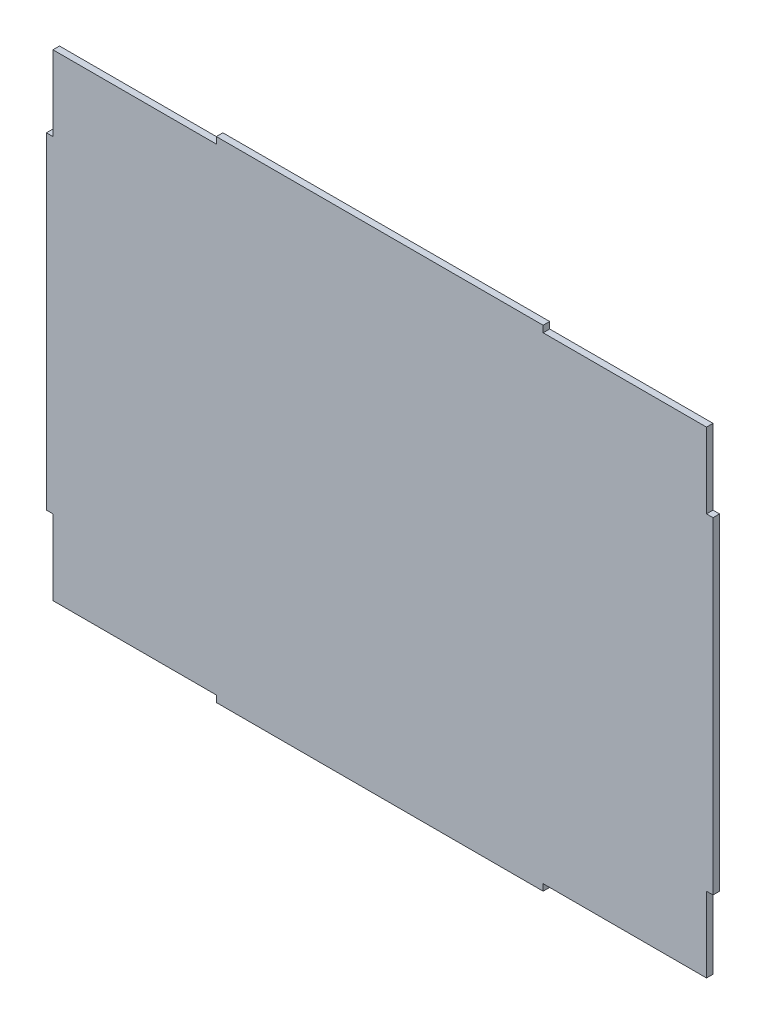
ISO-10303-21;
HEADER;
FILE_DESCRIPTION(('STEP AP214'),'2;1');
FILE_NAME('part.step','',(''),(''),'','','');
FILE_SCHEMA(('AUTOMOTIVE_DESIGN { 1 0 10303 214 1 1 1 1 }'));
ENDSEC;
DATA;
#1=APPLICATION_CONTEXT('core data for automotive mechanical design processes');
#2=APPLICATION_PROTOCOL_DEFINITION('international standard','automotive_design',2000,#1);
#3=PRODUCT_CONTEXT('',#1,'mechanical');
#4=PRODUCT('Part','Part','',(#3));
#5=PRODUCT_RELATED_PRODUCT_CATEGORY('part','',(#4));
#6=PRODUCT_DEFINITION_FORMATION('','',#4);
#7=PRODUCT_DEFINITION_CONTEXT('part definition',#1,'design');
#8=PRODUCT_DEFINITION('design','',#6,#7);
#9=PRODUCT_DEFINITION_SHAPE('','',#8);
#10=(LENGTH_UNIT() NAMED_UNIT(*) SI_UNIT(.MILLI.,.METRE.));
#11=(NAMED_UNIT(*) PLANE_ANGLE_UNIT() SI_UNIT($,.RADIAN.));
#12=(NAMED_UNIT(*) SI_UNIT($,.STERADIAN.) SOLID_ANGLE_UNIT());
#13=UNCERTAINTY_MEASURE_WITH_UNIT(LENGTH_MEASURE(1.E-05),#10,'distance_accuracy_value','');
#14=(GEOMETRIC_REPRESENTATION_CONTEXT(3) GLOBAL_UNCERTAINTY_ASSIGNED_CONTEXT((#13)) GLOBAL_UNIT_ASSIGNED_CONTEXT((#10,
#11,#12)) REPRESENTATION_CONTEXT('',''));
#15=CARTESIAN_POINT('',(0.,0.,0.));
#16=DIRECTION('',(0.,0.,1.));
#17=DIRECTION('',(1.,0.,0.));
#18=AXIS2_PLACEMENT_3D('',#15,#16,#17);
#19=CARTESIAN_POINT('',(0.,0.,2.));
#20=DIRECTION('',(0.,-1.,0.));
#21=DIRECTION('',(0.,0.,-1.));
#22=AXIS2_PLACEMENT_3D('',#19,#20,#21);
#23=PLANE('',#22);
#24=DIRECTION('',(-1.,0.,0.));
#25=VECTOR('',#24,1.);
#26=CARTESIAN_POINT('',(0.,0.,0.));
#27=LINE('',#26,#25);
#28=CARTESIAN_POINT('',(50.,0.,0.));
#29=VERTEX_POINT('',#28);
#30=CARTESIAN_POINT('',(0.,0.,0.));
#31=VERTEX_POINT('',#30);
#32=EDGE_CURVE('E158',#29,#31,#27,.T.);
#33=ORIENTED_EDGE('',*,*,#32,.T.);
#34=DIRECTION('',(0.,0.,-1.));
#35=VECTOR('',#34,1.);
#36=CARTESIAN_POINT('',(0.,0.,2.));
#37=LINE('',#36,#35);
#38=CARTESIAN_POINT('',(0.,0.,2.));
#39=VERTEX_POINT('',#38);
#40=EDGE_CURVE('E11',#39,#31,#37,.T.);
#41=ORIENTED_EDGE('',*,*,#40,.F.);
#42=DIRECTION('',(-1.,0.,0.));
#43=VECTOR('',#42,1.);
#44=CARTESIAN_POINT('',(0.,0.,2.));
#45=LINE('',#44,#43);
#46=CARTESIAN_POINT('',(50.,0.,2.));
#47=VERTEX_POINT('',#46);
#48=EDGE_CURVE('E179',#47,#39,#45,.T.);
#49=ORIENTED_EDGE('',*,*,#48,.F.);
#50=DIRECTION('',(0.,0.,-1.));
#51=VECTOR('',#50,1.);
#52=CARTESIAN_POINT('',(50.,0.,2.));
#53=LINE('',#52,#51);
#54=EDGE_CURVE('E157',#47,#29,#53,.T.);
#55=ORIENTED_EDGE('',*,*,#54,.T.);
#56=EDGE_LOOP('',(#33,#41,#49,#55));
#57=FACE_BOUND('',#56,.T.);
#58=ADVANCED_FACE('F33',(#57),#23,.F.);
#59=CARTESIAN_POINT('',(0.,0.,2.));
#60=DIRECTION('',(1.,0.,0.));
#61=DIRECTION('',(0.,1.,0.));
#62=AXIS2_PLACEMENT_3D('',#59,#60,#61);
#63=PLANE('',#62);
#64=DIRECTION('',(0.,-1.,0.));
#65=VECTOR('',#64,1.);
#66=CARTESIAN_POINT('',(0.,0.,0.));
#67=LINE('',#66,#65);
#68=CARTESIAN_POINT('',(0.,-23.,0.));
#69=VERTEX_POINT('',#68);
#70=EDGE_CURVE('E161',#31,#69,#67,.T.);
#71=ORIENTED_EDGE('',*,*,#70,.T.);
#72=DIRECTION('',(0.,0.,-1.));
#73=VECTOR('',#72,1.);
#74=CARTESIAN_POINT('',(0.,-23.,2.));
#75=LINE('',#74,#73);
#76=CARTESIAN_POINT('',(0.,-23.,2.));
#77=VERTEX_POINT('',#76);
#78=EDGE_CURVE('E41',#77,#69,#75,.T.);
#79=ORIENTED_EDGE('',*,*,#78,.F.);
#80=DIRECTION('',(0.,-1.,0.));
#81=VECTOR('',#80,1.);
#82=CARTESIAN_POINT('',(0.,0.,2.));
#83=LINE('',#82,#81);
#84=EDGE_CURVE('E99',#39,#77,#83,.T.);
#85=ORIENTED_EDGE('',*,*,#84,.F.);
#86=ORIENTED_EDGE('',*,*,#40,.T.);
#87=EDGE_LOOP('',(#71,#79,#85,#86));
#88=FACE_BOUND('',#87,.T.);
#89=ADVANCED_FACE('F380',(#88),#63,.F.);
#90=CARTESIAN_POINT('',(0.,-23.,2.));
#91=DIRECTION('',(0.,-1.,0.));
#92=DIRECTION('',(0.,0.,-1.));
#93=AXIS2_PLACEMENT_3D('',#90,#91,#92);
#94=PLANE('',#93);
#95=DIRECTION('',(-1.,0.,0.));
#96=VECTOR('',#95,1.);
#97=CARTESIAN_POINT('',(0.,-23.,0.));
#98=LINE('',#97,#96);
#99=CARTESIAN_POINT('',(-2.,-23.,0.));
#100=VERTEX_POINT('',#99);
#101=EDGE_CURVE('E164',#69,#100,#98,.T.);
#102=ORIENTED_EDGE('',*,*,#101,.T.);
#103=DIRECTION('',(0.,0.,-1.));
#104=VECTOR('',#103,1.);
#105=CARTESIAN_POINT('',(-2.,-23.,2.));
#106=LINE('',#105,#104);
#107=CARTESIAN_POINT('',(-2.,-23.,2.));
#108=VERTEX_POINT('',#107);
#109=EDGE_CURVE('E192',#108,#100,#106,.T.);
#110=ORIENTED_EDGE('',*,*,#109,.F.);
#111=DIRECTION('',(-1.,0.,0.));
#112=VECTOR('',#111,1.);
#113=CARTESIAN_POINT('',(0.,-23.,2.));
#114=LINE('',#113,#112);
#115=EDGE_CURVE('E200',#77,#108,#114,.T.);
#116=ORIENTED_EDGE('',*,*,#115,.F.);
#117=ORIENTED_EDGE('',*,*,#78,.T.);
#118=EDGE_LOOP('',(#102,#110,#116,#117));
#119=FACE_BOUND('',#118,.T.);
#120=ADVANCED_FACE('F198',(#119),#94,.F.);
#121=CARTESIAN_POINT('',(-2.,-23.,2.));
#122=DIRECTION('',(1.,0.,0.));
#123=DIRECTION('',(0.,1.,0.));
#124=AXIS2_PLACEMENT_3D('',#121,#122,#123);
#125=PLANE('',#124);
#126=DIRECTION('',(0.,-1.,0.));
#127=VECTOR('',#126,1.);
#128=CARTESIAN_POINT('',(-2.,-23.,0.));
#129=LINE('',#128,#127);
#130=CARTESIAN_POINT('',(-1.99999999999998,-123.,0.));
#131=VERTEX_POINT('',#130);
#132=EDGE_CURVE('E166',#100,#131,#129,.T.);
#133=ORIENTED_EDGE('',*,*,#132,.T.);
#134=DIRECTION('',(0.,0.,-1.));
#135=VECTOR('',#134,1.);
#136=CARTESIAN_POINT('',(-1.99999999999998,-123.,2.));
#137=LINE('',#136,#135);
#138=CARTESIAN_POINT('',(-1.99999999999998,-123.,2.));
#139=VERTEX_POINT('',#138);
#140=EDGE_CURVE('E189',#139,#131,#137,.T.);
#141=ORIENTED_EDGE('',*,*,#140,.F.);
#142=DIRECTION('',(0.,-1.,0.));
#143=VECTOR('',#142,1.);
#144=CARTESIAN_POINT('',(-2.,-23.,2.));
#145=LINE('',#144,#143);
#146=EDGE_CURVE('E218',#108,#139,#145,.T.);
#147=ORIENTED_EDGE('',*,*,#146,.F.);
#148=ORIENTED_EDGE('',*,*,#109,.T.);
#149=EDGE_LOOP('',(#133,#141,#147,#148));
#150=FACE_BOUND('',#149,.T.);
#151=ADVANCED_FACE('F209',(#150),#125,.F.);
#152=CARTESIAN_POINT('',(-1.99999999999998,-123.,2.));
#153=DIRECTION('',(0.,1.,0.));
#154=DIRECTION('',(0.,0.,1.));
#155=AXIS2_PLACEMENT_3D('',#152,#153,#154);
#156=PLANE('',#155);
#157=DIRECTION('',(1.,0.,0.));
#158=VECTOR('',#157,1.);
#159=CARTESIAN_POINT('',(-1.99999999999998,-123.,0.));
#160=LINE('',#159,#158);
#161=CARTESIAN_POINT('',(0.,-123.,0.));
#162=VERTEX_POINT('',#161);
#163=EDGE_CURVE('E168',#131,#162,#160,.T.);
#164=ORIENTED_EDGE('',*,*,#163,.T.);
#165=DIRECTION('',(0.,0.,-1.));
#166=VECTOR('',#165,1.);
#167=CARTESIAN_POINT('',(0.,-123.,2.));
#168=LINE('',#167,#166);
#169=CARTESIAN_POINT('',(0.,-123.,2.));
#170=VERTEX_POINT('',#169);
#171=EDGE_CURVE('E186',#170,#162,#168,.T.);
#172=ORIENTED_EDGE('',*,*,#171,.F.);
#173=DIRECTION('',(1.,0.,0.));
#174=VECTOR('',#173,1.);
#175=CARTESIAN_POINT('',(-1.99999999999998,-123.,2.));
#176=LINE('',#175,#174);
#177=EDGE_CURVE('E215',#139,#170,#176,.T.);
#178=ORIENTED_EDGE('',*,*,#177,.F.);
#179=ORIENTED_EDGE('',*,*,#140,.T.);
#180=EDGE_LOOP('',(#164,#172,#178,#179));
#181=FACE_BOUND('',#180,.T.);
#182=ADVANCED_FACE('F213',(#181),#156,.F.);
#183=CARTESIAN_POINT('',(0.,-123.,2.));
#184=DIRECTION('',(1.,0.,0.));
#185=DIRECTION('',(0.,1.,0.));
#186=AXIS2_PLACEMENT_3D('',#183,#184,#185);
#187=PLANE('',#186);
#188=DIRECTION('',(0.,-1.,0.));
#189=VECTOR('',#188,1.);
#190=CARTESIAN_POINT('',(0.,-123.,0.));
#191=LINE('',#190,#189);
#192=CARTESIAN_POINT('',(0.,-146.,0.));
#193=VERTEX_POINT('',#192);
#194=EDGE_CURVE('E170',#162,#193,#191,.T.);
#195=ORIENTED_EDGE('',*,*,#194,.T.);
#196=DIRECTION('',(0.,0.,-1.));
#197=VECTOR('',#196,1.);
#198=CARTESIAN_POINT('',(0.,-146.,2.));
#199=LINE('',#198,#197);
#200=CARTESIAN_POINT('',(0.,-146.,2.));
#201=VERTEX_POINT('',#200);
#202=EDGE_CURVE('E183',#201,#193,#199,.T.);
#203=ORIENTED_EDGE('',*,*,#202,.F.);
#204=DIRECTION('',(0.,-1.,0.));
#205=VECTOR('',#204,1.);
#206=CARTESIAN_POINT('',(0.,-123.,2.));
#207=LINE('',#206,#205);
#208=EDGE_CURVE('E217',#170,#201,#207,.T.);
#209=ORIENTED_EDGE('',*,*,#208,.F.);
#210=ORIENTED_EDGE('',*,*,#171,.T.);
#211=EDGE_LOOP('',(#195,#203,#209,#210));
#212=FACE_BOUND('',#211,.T.);
#213=ADVANCED_FACE('F392',(#212),#187,.F.);
#214=CARTESIAN_POINT('',(0.,-146.,2.));
#215=DIRECTION('',(0.,1.,0.));
#216=DIRECTION('',(0.,0.,1.));
#217=AXIS2_PLACEMENT_3D('',#214,#215,#216);
#218=PLANE('',#217);
#219=DIRECTION('',(1.,0.,0.));
#220=VECTOR('',#219,1.);
#221=CARTESIAN_POINT('',(0.,-146.,0.));
#222=LINE('',#221,#220);
#223=CARTESIAN_POINT('',(50.,-146.,0.));
#224=VERTEX_POINT('',#223);
#225=EDGE_CURVE('E172',#193,#224,#222,.T.);
#226=ORIENTED_EDGE('',*,*,#225,.T.);
#227=DIRECTION('',(0.,0.,-1.));
#228=VECTOR('',#227,1.);
#229=CARTESIAN_POINT('',(50.,-146.,2.));
#230=LINE('',#229,#228);
#231=CARTESIAN_POINT('',(50.,-146.,2.));
#232=VERTEX_POINT('',#231);
#233=EDGE_CURVE('E144',#232,#224,#230,.T.);
#234=ORIENTED_EDGE('',*,*,#233,.F.);
#235=DIRECTION('',(1.,0.,0.));
#236=VECTOR('',#235,1.);
#237=CARTESIAN_POINT('',(0.,-146.,2.));
#238=LINE('',#237,#236);
#239=EDGE_CURVE('E131',#201,#232,#238,.T.);
#240=ORIENTED_EDGE('',*,*,#239,.F.);
#241=ORIENTED_EDGE('',*,*,#202,.T.);
#242=EDGE_LOOP('',(#226,#234,#240,#241));
#243=FACE_BOUND('',#242,.T.);
#244=ADVANCED_FACE('F395',(#243),#218,.F.);
#245=CARTESIAN_POINT('',(50.,-146.,2.));
#246=DIRECTION('',(1.,0.,0.));
#247=DIRECTION('',(0.,0.,-1.));
#248=AXIS2_PLACEMENT_3D('',#245,#246,#247);
#249=PLANE('',#248);
#250=DIRECTION('',(0.,-1.,0.));
#251=VECTOR('',#250,1.);
#252=CARTESIAN_POINT('',(50.,-146.,0.));
#253=LINE('',#252,#251);
#254=CARTESIAN_POINT('',(50.,-148.,0.));
#255=VERTEX_POINT('',#254);
#256=EDGE_CURVE('E140',#224,#255,#253,.T.);
#257=ORIENTED_EDGE('',*,*,#256,.T.);
#258=DIRECTION('',(0.,0.,-1.));
#259=VECTOR('',#258,1.);
#260=CARTESIAN_POINT('',(50.,-148.,2.));
#261=LINE('',#260,#259);
#262=CARTESIAN_POINT('',(50.,-148.,2.));
#263=VERTEX_POINT('',#262);
#264=EDGE_CURVE('E137',#263,#255,#261,.T.);
#265=ORIENTED_EDGE('',*,*,#264,.F.);
#266=DIRECTION('',(0.,-1.,0.));
#267=VECTOR('',#266,1.);
#268=CARTESIAN_POINT('',(50.,-146.,2.));
#269=LINE('',#268,#267);
#270=EDGE_CURVE('E122',#232,#263,#269,.T.);
#271=ORIENTED_EDGE('',*,*,#270,.F.);
#272=ORIENTED_EDGE('',*,*,#233,.T.);
#273=EDGE_LOOP('',(#257,#265,#271,#272));
#274=FACE_BOUND('',#273,.T.);
#275=ADVANCED_FACE('F138',(#274),#249,.F.);
#276=CARTESIAN_POINT('',(50.,-148.,2.));
#277=DIRECTION('',(0.,1.,0.));
#278=DIRECTION('',(0.,0.,1.));
#279=AXIS2_PLACEMENT_3D('',#276,#277,#278);
#280=PLANE('',#279);
#281=DIRECTION('',(1.,0.,0.));
#282=VECTOR('',#281,1.);
#283=CARTESIAN_POINT('',(50.,-148.,0.));
#284=LINE('',#283,#282);
#285=CARTESIAN_POINT('',(150.,-148.,0.));
#286=VERTEX_POINT('',#285);
#287=EDGE_CURVE('E175',#255,#286,#284,.T.);
#288=ORIENTED_EDGE('',*,*,#287,.T.);
#289=DIRECTION('',(0.,0.,-1.));
#290=VECTOR('',#289,1.);
#291=CARTESIAN_POINT('',(150.,-148.,2.));
#292=LINE('',#291,#290);
#293=CARTESIAN_POINT('',(150.,-148.,2.));
#294=VERTEX_POINT('',#293);
#295=EDGE_CURVE('E149',#294,#286,#292,.T.);
#296=ORIENTED_EDGE('',*,*,#295,.F.);
#297=DIRECTION('',(1.,0.,0.));
#298=VECTOR('',#297,1.);
#299=CARTESIAN_POINT('',(50.,-148.,2.));
#300=LINE('',#299,#298);
#301=EDGE_CURVE('E128',#263,#294,#300,.T.);
#302=ORIENTED_EDGE('',*,*,#301,.F.);
#303=ORIENTED_EDGE('',*,*,#264,.T.);
#304=EDGE_LOOP('',(#288,#296,#302,#303));
#305=FACE_BOUND('',#304,.T.);
#306=ADVANCED_FACE('F147',(#305),#280,.F.);
#307=CARTESIAN_POINT('',(100.,2.00000000000001,2.));
#308=DIRECTION('',(0.,-1.,0.));
#309=DIRECTION('',(1.,0.,0.));
#310=AXIS2_PLACEMENT_3D('',#307,#308,#309);
#311=PLANE('',#310);
#312=DIRECTION('',(-1.,0.,0.));
#313=VECTOR('',#312,1.);
#314=CARTESIAN_POINT('',(100.,2.00000000000001,0.));
#315=LINE('',#314,#313);
#316=CARTESIAN_POINT('',(150.,2.00000000000001,0.));
#317=VERTEX_POINT('',#316);
#318=CARTESIAN_POINT('',(50.,2.,0.));
#319=VERTEX_POINT('',#318);
#320=EDGE_CURVE('E85',#317,#319,#315,.T.);
#321=ORIENTED_EDGE('',*,*,#320,.T.);
#322=DIRECTION('',(0.,0.,-1.));
#323=VECTOR('',#322,1.);
#324=CARTESIAN_POINT('',(50.,2.,2.));
#325=LINE('',#324,#323);
#326=CARTESIAN_POINT('',(50.,2.,2.));
#327=VERTEX_POINT('',#326);
#328=EDGE_CURVE('E145',#327,#319,#325,.T.);
#329=ORIENTED_EDGE('',*,*,#328,.F.);
#330=DIRECTION('',(-1.,0.,0.));
#331=VECTOR('',#330,1.);
#332=CARTESIAN_POINT('',(100.,2.00000000000001,2.));
#333=LINE('',#332,#331);
#334=CARTESIAN_POINT('',(150.,2.00000000000001,2.));
#335=VERTEX_POINT('',#334);
#336=EDGE_CURVE('E151',#335,#327,#333,.T.);
#337=ORIENTED_EDGE('',*,*,#336,.F.);
#338=DIRECTION('',(0.,0.,-1.));
#339=VECTOR('',#338,1.);
#340=CARTESIAN_POINT('',(150.,2.00000000000001,2.));
#341=LINE('',#340,#339);
#342=EDGE_CURVE('E228',#335,#317,#341,.T.);
#343=ORIENTED_EDGE('',*,*,#342,.T.);
#344=EDGE_LOOP('',(#321,#329,#337,#343));
#345=FACE_BOUND('',#344,.T.);
#346=ADVANCED_FACE('F375',(#345),#311,.F.);
#347=CARTESIAN_POINT('',(50.,2.,2.));
#348=DIRECTION('',(1.,0.,0.));
#349=DIRECTION('',(0.,0.,-1.));
#350=AXIS2_PLACEMENT_3D('',#347,#348,#349);
#351=PLANE('',#350);
#352=DIRECTION('',(0.,-1.,0.));
#353=VECTOR('',#352,1.);
#354=CARTESIAN_POINT('',(50.,2.,0.));
#355=LINE('',#354,#353);
#356=EDGE_CURVE('E91',#319,#29,#355,.T.);
#357=ORIENTED_EDGE('',*,*,#356,.T.);
#358=ORIENTED_EDGE('',*,*,#54,.F.);
#359=DIRECTION('',(0.,-1.,0.));
#360=VECTOR('',#359,1.);
#361=CARTESIAN_POINT('',(50.,2.,2.));
#362=LINE('',#361,#360);
#363=EDGE_CURVE('E49',#327,#47,#362,.T.);
#364=ORIENTED_EDGE('',*,*,#363,.F.);
#365=ORIENTED_EDGE('',*,*,#328,.T.);
#366=EDGE_LOOP('',(#357,#358,#364,#365));
#367=FACE_BOUND('',#366,.T.);
#368=ADVANCED_FACE('F376',(#367),#351,.F.);
#369=CARTESIAN_POINT('',(0.,0.,2.));
#370=DIRECTION('',(0.,0.,-1.));
#371=DIRECTION('',(-1.,0.,0.));
#372=AXIS2_PLACEMENT_3D('',#369,#370,#371);
#373=PLANE('',#372);
#374=ORIENTED_EDGE('',*,*,#48,.T.);
#375=ORIENTED_EDGE('',*,*,#84,.T.);
#376=ORIENTED_EDGE('',*,*,#115,.T.);
#377=ORIENTED_EDGE('',*,*,#146,.T.);
#378=ORIENTED_EDGE('',*,*,#177,.T.);
#379=ORIENTED_EDGE('',*,*,#208,.T.);
#380=ORIENTED_EDGE('',*,*,#239,.T.);
#381=ORIENTED_EDGE('',*,*,#270,.T.);
#382=ORIENTED_EDGE('',*,*,#301,.T.);
#383=DIRECTION('',(0.,-1.,0.));
#384=VECTOR('',#383,1.);
#385=CARTESIAN_POINT('',(150.,-146.,2.));
#386=LINE('',#385,#384);
#387=CARTESIAN_POINT('',(150.,-146.,2.));
#388=VERTEX_POINT('',#387);
#389=EDGE_CURVE('E298',#388,#294,#386,.T.);
#390=ORIENTED_EDGE('',*,*,#389,.F.);
#391=DIRECTION('',(-1.,0.,0.));
#392=VECTOR('',#391,1.);
#393=CARTESIAN_POINT('',(200.,-146.,2.));
#394=LINE('',#393,#392);
#395=CARTESIAN_POINT('',(200.,-146.,2.));
#396=VERTEX_POINT('',#395);
#397=EDGE_CURVE('E295',#396,#388,#394,.T.);
#398=ORIENTED_EDGE('',*,*,#397,.F.);
#399=DIRECTION('',(0.,-1.,0.));
#400=VECTOR('',#399,1.);
#401=CARTESIAN_POINT('',(200.,-123.,2.));
#402=LINE('',#401,#400);
#403=CARTESIAN_POINT('',(200.,-123.,2.));
#404=VERTEX_POINT('',#403);
#405=EDGE_CURVE('E292',#404,#396,#402,.T.);
#406=ORIENTED_EDGE('',*,*,#405,.F.);
#407=DIRECTION('',(-1.,0.,0.));
#408=VECTOR('',#407,1.);
#409=CARTESIAN_POINT('',(202.,-123.,2.));
#410=LINE('',#409,#408);
#411=CARTESIAN_POINT('',(202.,-123.,2.));
#412=VERTEX_POINT('',#411);
#413=EDGE_CURVE('E289',#412,#404,#410,.T.);
#414=ORIENTED_EDGE('',*,*,#413,.F.);
#415=DIRECTION('',(0.,-1.,0.));
#416=VECTOR('',#415,1.);
#417=CARTESIAN_POINT('',(202.,-23.,2.));
#418=LINE('',#417,#416);
#419=CARTESIAN_POINT('',(202.,-23.,2.));
#420=VERTEX_POINT('',#419);
#421=EDGE_CURVE('E286',#420,#412,#418,.T.);
#422=ORIENTED_EDGE('',*,*,#421,.F.);
#423=DIRECTION('',(1.,0.,0.));
#424=VECTOR('',#423,1.);
#425=CARTESIAN_POINT('',(200.,-23.,2.));
#426=LINE('',#425,#424);
#427=CARTESIAN_POINT('',(200.,-23.,2.));
#428=VERTEX_POINT('',#427);
#429=EDGE_CURVE('E283',#428,#420,#426,.T.);
#430=ORIENTED_EDGE('',*,*,#429,.F.);
#431=DIRECTION('',(0.,-1.,0.));
#432=VECTOR('',#431,1.);
#433=CARTESIAN_POINT('',(200.,0.,2.));
#434=LINE('',#433,#432);
#435=CARTESIAN_POINT('',(200.,0.,2.));
#436=VERTEX_POINT('',#435);
#437=EDGE_CURVE('E252',#436,#428,#434,.T.);
#438=ORIENTED_EDGE('',*,*,#437,.F.);
#439=DIRECTION('',(1.,0.,0.));
#440=VECTOR('',#439,1.);
#441=CARTESIAN_POINT('',(200.,0.,2.));
#442=LINE('',#441,#440);
#443=CARTESIAN_POINT('',(150.,0.,2.));
#444=VERTEX_POINT('',#443);
#445=EDGE_CURVE('E256',#444,#436,#442,.T.);
#446=ORIENTED_EDGE('',*,*,#445,.F.);
#447=DIRECTION('',(0.,-1.,0.));
#448=VECTOR('',#447,1.);
#449=CARTESIAN_POINT('',(150.,2.00000000000001,2.));
#450=LINE('',#449,#448);
#451=EDGE_CURVE('E300',#335,#444,#450,.T.);
#452=ORIENTED_EDGE('',*,*,#451,.F.);
#453=ORIENTED_EDGE('',*,*,#336,.T.);
#454=ORIENTED_EDGE('',*,*,#363,.T.);
#455=EDGE_LOOP('',(#374,#375,#376,#377,#378,#379,#380,#381,#382,#390,#398,#406,#414,#422,#430,
#438,#446,#452,#453,#454));
#456=FACE_BOUND('',#455,.T.);
#457=ADVANCED_FACE('F124',(#456),#373,.F.);
#458=CARTESIAN_POINT('',(0.,0.,0.));
#459=DIRECTION('',(0.,0.,-1.));
#460=DIRECTION('',(-1.,0.,0.));
#461=AXIS2_PLACEMENT_3D('',#458,#459,#460);
#462=PLANE('',#461);
#463=ORIENTED_EDGE('',*,*,#32,.F.);
#464=ORIENTED_EDGE('',*,*,#356,.F.);
#465=ORIENTED_EDGE('',*,*,#320,.F.);
#466=DIRECTION('',(0.,-1.,0.));
#467=VECTOR('',#466,1.);
#468=CARTESIAN_POINT('',(150.,2.00000000000001,0.));
#469=LINE('',#468,#467);
#470=CARTESIAN_POINT('',(150.,0.,0.));
#471=VERTEX_POINT('',#470);
#472=EDGE_CURVE('E275',#317,#471,#469,.T.);
#473=ORIENTED_EDGE('',*,*,#472,.T.);
#474=DIRECTION('',(1.,0.,0.));
#475=VECTOR('',#474,1.);
#476=CARTESIAN_POINT('',(200.,0.,0.));
#477=LINE('',#476,#475);
#478=CARTESIAN_POINT('',(200.,0.,0.));
#479=VERTEX_POINT('',#478);
#480=EDGE_CURVE('E278',#471,#479,#477,.T.);
#481=ORIENTED_EDGE('',*,*,#480,.T.);
#482=DIRECTION('',(0.,-1.,0.));
#483=VECTOR('',#482,1.);
#484=CARTESIAN_POINT('',(200.,0.,0.));
#485=LINE('',#484,#483);
#486=CARTESIAN_POINT('',(200.,-23.,0.));
#487=VERTEX_POINT('',#486);
#488=EDGE_CURVE('E253',#479,#487,#485,.T.);
#489=ORIENTED_EDGE('',*,*,#488,.T.);
#490=DIRECTION('',(1.,0.,0.));
#491=VECTOR('',#490,1.);
#492=CARTESIAN_POINT('',(200.,-23.,0.));
#493=LINE('',#492,#491);
#494=CARTESIAN_POINT('',(202.,-23.,0.));
#495=VERTEX_POINT('',#494);
#496=EDGE_CURVE('E257',#487,#495,#493,.T.);
#497=ORIENTED_EDGE('',*,*,#496,.T.);
#498=DIRECTION('',(0.,-1.,0.));
#499=VECTOR('',#498,1.);
#500=CARTESIAN_POINT('',(202.,-23.,0.));
#501=LINE('',#500,#499);
#502=CARTESIAN_POINT('',(202.,-123.,0.));
#503=VERTEX_POINT('',#502);
#504=EDGE_CURVE('E260',#495,#503,#501,.T.);
#505=ORIENTED_EDGE('',*,*,#504,.T.);
#506=DIRECTION('',(-1.,0.,0.));
#507=VECTOR('',#506,1.);
#508=CARTESIAN_POINT('',(202.,-123.,0.));
#509=LINE('',#508,#507);
#510=CARTESIAN_POINT('',(200.,-123.,0.));
#511=VERTEX_POINT('',#510);
#512=EDGE_CURVE('E263',#503,#511,#509,.T.);
#513=ORIENTED_EDGE('',*,*,#512,.T.);
#514=DIRECTION('',(0.,-1.,0.));
#515=VECTOR('',#514,1.);
#516=CARTESIAN_POINT('',(200.,-123.,0.));
#517=LINE('',#516,#515);
#518=CARTESIAN_POINT('',(200.,-146.,0.));
#519=VERTEX_POINT('',#518);
#520=EDGE_CURVE('E266',#511,#519,#517,.T.);
#521=ORIENTED_EDGE('',*,*,#520,.T.);
#522=DIRECTION('',(-1.,0.,0.));
#523=VECTOR('',#522,1.);
#524=CARTESIAN_POINT('',(200.,-146.,0.));
#525=LINE('',#524,#523);
#526=CARTESIAN_POINT('',(150.,-146.,0.));
#527=VERTEX_POINT('',#526);
#528=EDGE_CURVE('E269',#519,#527,#525,.T.);
#529=ORIENTED_EDGE('',*,*,#528,.T.);
#530=DIRECTION('',(0.,-1.,0.));
#531=VECTOR('',#530,1.);
#532=CARTESIAN_POINT('',(150.,-146.,0.));
#533=LINE('',#532,#531);
#534=EDGE_CURVE('E272',#527,#286,#533,.T.);
#535=ORIENTED_EDGE('',*,*,#534,.T.);
#536=ORIENTED_EDGE('',*,*,#287,.F.);
#537=ORIENTED_EDGE('',*,*,#256,.F.);
#538=ORIENTED_EDGE('',*,*,#225,.F.);
#539=ORIENTED_EDGE('',*,*,#194,.F.);
#540=ORIENTED_EDGE('',*,*,#163,.F.);
#541=ORIENTED_EDGE('',*,*,#132,.F.);
#542=ORIENTED_EDGE('',*,*,#101,.F.);
#543=ORIENTED_EDGE('',*,*,#70,.F.);
#544=EDGE_LOOP('',(#463,#464,#465,#473,#481,#489,#497,#505,#513,#521,#529,#535,#536,#537,#538,
#539,#540,#541,#542,#543));
#545=FACE_BOUND('',#544,.T.);
#546=ADVANCED_FACE('F204',(#545),#462,.T.);
#547=CARTESIAN_POINT('',(200.,0.,2.));
#548=DIRECTION('',(0.,1.,0.));
#549=DIRECTION('',(-1.,0.,0.));
#550=AXIS2_PLACEMENT_3D('',#547,#548,#549);
#551=PLANE('',#550);
#552=ORIENTED_EDGE('',*,*,#480,.F.);
#553=DIRECTION('',(0.,0.,-1.));
#554=VECTOR('',#553,1.);
#555=CARTESIAN_POINT('',(150.,0.,2.));
#556=LINE('',#555,#554);
#557=EDGE_CURVE('E162',#444,#471,#556,.T.);
#558=ORIENTED_EDGE('',*,*,#557,.F.);
#559=ORIENTED_EDGE('',*,*,#445,.T.);
#560=DIRECTION('',(0.,0.,-1.));
#561=VECTOR('',#560,1.);
#562=CARTESIAN_POINT('',(200.,0.,2.));
#563=LINE('',#562,#561);
#564=EDGE_CURVE('E249',#436,#479,#563,.T.);
#565=ORIENTED_EDGE('',*,*,#564,.T.);
#566=EDGE_LOOP('',(#552,#558,#559,#565));
#567=FACE_BOUND('',#566,.T.);
#568=ADVANCED_FACE('F309',(#567),#551,.T.);
#569=CARTESIAN_POINT('',(150.,2.00000000000001,2.));
#570=DIRECTION('',(1.,0.,0.));
#571=DIRECTION('',(0.,1.,0.));
#572=AXIS2_PLACEMENT_3D('',#569,#570,#571);
#573=PLANE('',#572);
#574=ORIENTED_EDGE('',*,*,#472,.F.);
#575=ORIENTED_EDGE('',*,*,#342,.F.);
#576=ORIENTED_EDGE('',*,*,#451,.T.);
#577=ORIENTED_EDGE('',*,*,#557,.T.);
#578=EDGE_LOOP('',(#574,#575,#576,#577));
#579=FACE_BOUND('',#578,.T.);
#580=ADVANCED_FACE('F374',(#579),#573,.T.);
#581=CARTESIAN_POINT('',(150.,-146.,2.));
#582=DIRECTION('',(1.,0.,0.));
#583=DIRECTION('',(0.,1.,0.));
#584=AXIS2_PLACEMENT_3D('',#581,#582,#583);
#585=PLANE('',#584);
#586=ORIENTED_EDGE('',*,*,#534,.F.);
#587=DIRECTION('',(0.,0.,-1.));
#588=VECTOR('',#587,1.);
#589=CARTESIAN_POINT('',(150.,-146.,2.));
#590=LINE('',#589,#588);
#591=EDGE_CURVE('E231',#388,#527,#590,.T.);
#592=ORIENTED_EDGE('',*,*,#591,.F.);
#593=ORIENTED_EDGE('',*,*,#389,.T.);
#594=ORIENTED_EDGE('',*,*,#295,.T.);
#595=EDGE_LOOP('',(#586,#592,#593,#594));
#596=FACE_BOUND('',#595,.T.);
#597=ADVANCED_FACE('F416',(#596),#585,.T.);
#598=CARTESIAN_POINT('',(200.,-146.,2.));
#599=DIRECTION('',(0.,-1.,0.));
#600=DIRECTION('',(1.,0.,0.));
#601=AXIS2_PLACEMENT_3D('',#598,#599,#600);
#602=PLANE('',#601);
#603=ORIENTED_EDGE('',*,*,#528,.F.);
#604=DIRECTION('',(0.,0.,-1.));
#605=VECTOR('',#604,1.);
#606=CARTESIAN_POINT('',(200.,-146.,2.));
#607=LINE('',#606,#605);
#608=EDGE_CURVE('E234',#396,#519,#607,.T.);
#609=ORIENTED_EDGE('',*,*,#608,.F.);
#610=ORIENTED_EDGE('',*,*,#397,.T.);
#611=ORIENTED_EDGE('',*,*,#591,.T.);
#612=EDGE_LOOP('',(#603,#609,#610,#611));
#613=FACE_BOUND('',#612,.T.);
#614=ADVANCED_FACE('F419',(#613),#602,.T.);
#615=CARTESIAN_POINT('',(200.,-123.,2.));
#616=DIRECTION('',(1.,0.,0.));
#617=DIRECTION('',(0.,1.,0.));
#618=AXIS2_PLACEMENT_3D('',#615,#616,#617);
#619=PLANE('',#618);
#620=ORIENTED_EDGE('',*,*,#520,.F.);
#621=DIRECTION('',(0.,0.,-1.));
#622=VECTOR('',#621,1.);
#623=CARTESIAN_POINT('',(200.,-123.,2.));
#624=LINE('',#623,#622);
#625=EDGE_CURVE('E237',#404,#511,#624,.T.);
#626=ORIENTED_EDGE('',*,*,#625,.F.);
#627=ORIENTED_EDGE('',*,*,#405,.T.);
#628=ORIENTED_EDGE('',*,*,#608,.T.);
#629=EDGE_LOOP('',(#620,#626,#627,#628));
#630=FACE_BOUND('',#629,.T.);
#631=ADVANCED_FACE('F423',(#630),#619,.T.);
#632=CARTESIAN_POINT('',(202.,-123.,2.));
#633=DIRECTION('',(0.,-1.,0.));
#634=DIRECTION('',(1.,0.,0.));
#635=AXIS2_PLACEMENT_3D('',#632,#633,#634);
#636=PLANE('',#635);
#637=ORIENTED_EDGE('',*,*,#512,.F.);
#638=DIRECTION('',(0.,0.,-1.));
#639=VECTOR('',#638,1.);
#640=CARTESIAN_POINT('',(202.,-123.,2.));
#641=LINE('',#640,#639);
#642=EDGE_CURVE('E240',#412,#503,#641,.T.);
#643=ORIENTED_EDGE('',*,*,#642,.F.);
#644=ORIENTED_EDGE('',*,*,#413,.T.);
#645=ORIENTED_EDGE('',*,*,#625,.T.);
#646=EDGE_LOOP('',(#637,#643,#644,#645));
#647=FACE_BOUND('',#646,.T.);
#648=ADVANCED_FACE('F364',(#647),#636,.T.);
#649=CARTESIAN_POINT('',(202.,-23.,2.));
#650=DIRECTION('',(1.,0.,0.));
#651=DIRECTION('',(0.,1.,0.));
#652=AXIS2_PLACEMENT_3D('',#649,#650,#651);
#653=PLANE('',#652);
#654=ORIENTED_EDGE('',*,*,#504,.F.);
#655=DIRECTION('',(0.,0.,-1.));
#656=VECTOR('',#655,1.);
#657=CARTESIAN_POINT('',(202.,-23.,2.));
#658=LINE('',#657,#656);
#659=EDGE_CURVE('E243',#420,#495,#658,.T.);
#660=ORIENTED_EDGE('',*,*,#659,.F.);
#661=ORIENTED_EDGE('',*,*,#421,.T.);
#662=ORIENTED_EDGE('',*,*,#642,.T.);
#663=EDGE_LOOP('',(#654,#660,#661,#662));
#664=FACE_BOUND('',#663,.T.);
#665=ADVANCED_FACE('F369',(#664),#653,.T.);
#666=CARTESIAN_POINT('',(200.,-23.,2.));
#667=DIRECTION('',(0.,1.,0.));
#668=DIRECTION('',(-1.,0.,0.));
#669=AXIS2_PLACEMENT_3D('',#666,#667,#668);
#670=PLANE('',#669);
#671=ORIENTED_EDGE('',*,*,#496,.F.);
#672=DIRECTION('',(0.,0.,-1.));
#673=VECTOR('',#672,1.);
#674=CARTESIAN_POINT('',(200.,-23.,2.));
#675=LINE('',#674,#673);
#676=EDGE_CURVE('E246',#428,#487,#675,.T.);
#677=ORIENTED_EDGE('',*,*,#676,.F.);
#678=ORIENTED_EDGE('',*,*,#429,.T.);
#679=ORIENTED_EDGE('',*,*,#659,.T.);
#680=EDGE_LOOP('',(#671,#677,#678,#679));
#681=FACE_BOUND('',#680,.T.);
#682=ADVANCED_FACE('F370',(#681),#670,.T.);
#683=CARTESIAN_POINT('',(200.,0.,2.));
#684=DIRECTION('',(1.,0.,0.));
#685=DIRECTION('',(0.,1.,0.));
#686=AXIS2_PLACEMENT_3D('',#683,#684,#685);
#687=PLANE('',#686);
#688=ORIENTED_EDGE('',*,*,#488,.F.);
#689=ORIENTED_EDGE('',*,*,#564,.F.);
#690=ORIENTED_EDGE('',*,*,#437,.T.);
#691=ORIENTED_EDGE('',*,*,#676,.T.);
#692=EDGE_LOOP('',(#688,#689,#690,#691));
#693=FACE_BOUND('',#692,.T.);
#694=ADVANCED_FACE('F319',(#693),#687,.T.);
#695=CLOSED_SHELL('',(#58,#89,#120,#151,#182,#213,#244,#275,#306,#346,#368,#457,#546,#568,#580,
#597,#614,#631,#648,#665,#682,#694));
#696=MANIFOLD_SOLID_BREP('B2',#695);
#697=ADVANCED_BREP_SHAPE_REPRESENTATION('',(#18,#696),#14);
#698=SHAPE_DEFINITION_REPRESENTATION(#9,#697);
ENDSEC;
END-ISO-10303-21;
